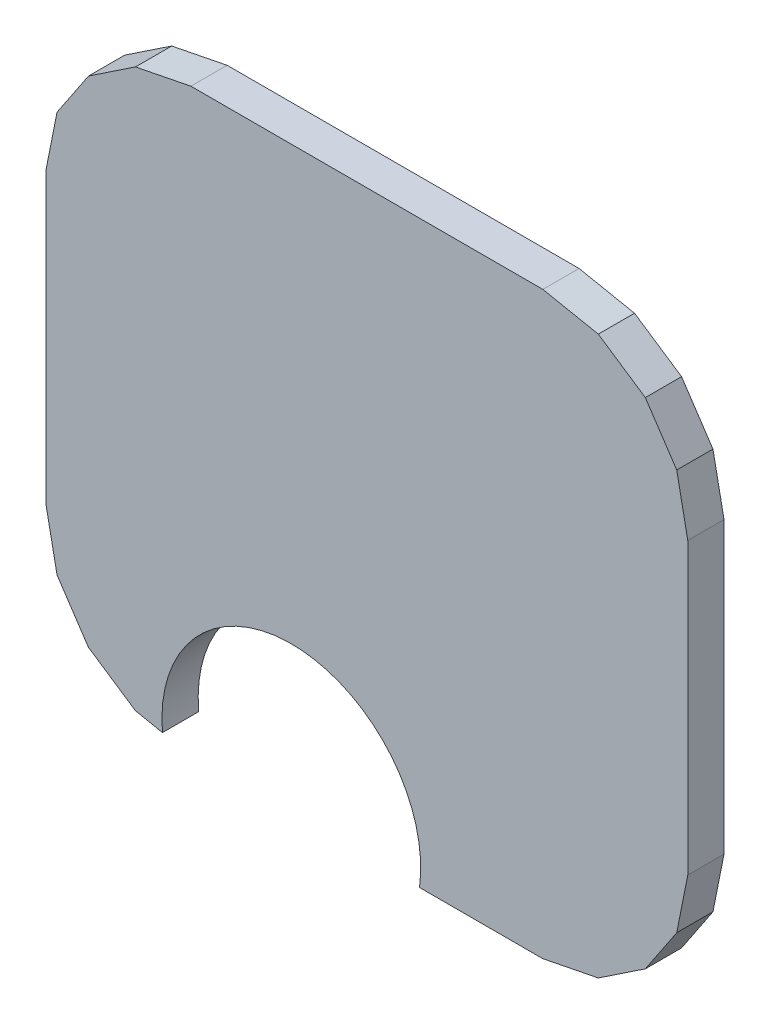
ISO-10303-21;
HEADER;
FILE_DESCRIPTION(('STEP AP214'),'2;1');
FILE_NAME('part.step','',(''),(''),'','','');
FILE_SCHEMA(('AUTOMOTIVE_DESIGN { 1 0 10303 214 1 1 1 1 }'));
ENDSEC;
DATA;
#1=APPLICATION_CONTEXT('core data for automotive mechanical design processes');
#2=APPLICATION_PROTOCOL_DEFINITION('international standard','automotive_design',2000,#1);
#3=PRODUCT_CONTEXT('',#1,'mechanical');
#4=PRODUCT('Part','Part','',(#3));
#5=PRODUCT_RELATED_PRODUCT_CATEGORY('part','',(#4));
#6=PRODUCT_DEFINITION_FORMATION('','',#4);
#7=PRODUCT_DEFINITION_CONTEXT('part definition',#1,'design');
#8=PRODUCT_DEFINITION('design','',#6,#7);
#9=PRODUCT_DEFINITION_SHAPE('','',#8);
#10=(LENGTH_UNIT() NAMED_UNIT(*) SI_UNIT(.MILLI.,.METRE.));
#11=(NAMED_UNIT(*) PLANE_ANGLE_UNIT() SI_UNIT($,.RADIAN.));
#12=(NAMED_UNIT(*) SI_UNIT($,.STERADIAN.) SOLID_ANGLE_UNIT());
#13=UNCERTAINTY_MEASURE_WITH_UNIT(LENGTH_MEASURE(1.E-05),#10,'distance_accuracy_value','');
#14=(GEOMETRIC_REPRESENTATION_CONTEXT(3) GLOBAL_UNCERTAINTY_ASSIGNED_CONTEXT((#13)) GLOBAL_UNIT_ASSIGNED_CONTEXT((#10,
#11,#12)) REPRESENTATION_CONTEXT('',''));
#15=CARTESIAN_POINT('',(0.,0.,0.));
#16=DIRECTION('',(0.,0.,1.));
#17=DIRECTION('',(1.,0.,0.));
#18=AXIS2_PLACEMENT_3D('',#15,#16,#17);
#19=CARTESIAN_POINT('',(153.083,-117.347,1.6));
#20=DIRECTION('',(1.,0.,0.));
#21=DIRECTION('',(0.,1.,0.));
#22=AXIS2_PLACEMENT_3D('',#19,#20,#21);
#23=PLANE('',#22);
#24=DIRECTION('',(0.,0.,1.));
#25=VECTOR('',#24,1.);
#26=CARTESIAN_POINT('',(153.083,-117.347,1.6));
#27=LINE('',#26,#25);
#28=CARTESIAN_POINT('',(153.083,-117.347,1.6));
#29=VERTEX_POINT('',#28);
#30=CARTESIAN_POINT('',(153.083,-117.347,1.635));
#31=VERTEX_POINT('',#30);
#32=EDGE_CURVE('E40',#29,#31,#27,.T.);
#33=ORIENTED_EDGE('',*,*,#32,.T.);
#34=DIRECTION('',(0.,-1.,0.));
#35=VECTOR('',#34,1.);
#36=CARTESIAN_POINT('',(153.083,-117.347,1.635));
#37=LINE('',#36,#35);
#38=CARTESIAN_POINT('',(153.083,-117.627,1.635));
#39=VERTEX_POINT('',#38);
#40=EDGE_CURVE('E419',#31,#39,#37,.T.);
#41=ORIENTED_EDGE('',*,*,#40,.T.);
#42=DIRECTION('',(0.,0.,1.));
#43=VECTOR('',#42,1.);
#44=CARTESIAN_POINT('',(153.083,-117.627,1.6));
#45=LINE('',#44,#43);
#46=CARTESIAN_POINT('',(153.083,-117.627,1.6));
#47=VERTEX_POINT('',#46);
#48=EDGE_CURVE('E11',#47,#39,#45,.T.);
#49=ORIENTED_EDGE('',*,*,#48,.F.);
#50=DIRECTION('',(0.,-1.,0.));
#51=VECTOR('',#50,1.);
#52=CARTESIAN_POINT('',(153.083,-117.347,1.6));
#53=LINE('',#52,#51);
#54=EDGE_CURVE('E274',#29,#47,#53,.T.);
#55=ORIENTED_EDGE('',*,*,#54,.F.);
#56=EDGE_LOOP('',(#33,#41,#49,#55));
#57=FACE_BOUND('',#56,.T.);
#58=ADVANCED_FACE('F17',(#57),#23,.T.);
#59=CARTESIAN_POINT('',(153.083,-117.627,1.6));
#60=DIRECTION('',(0.980785031686367,-0.195091572396073,0.));
#61=DIRECTION('',(0.,0.,-1.));
#62=AXIS2_PLACEMENT_3D('',#59,#60,#61);
#63=PLANE('',#62);
#64=ORIENTED_EDGE('',*,*,#48,.T.);
#65=DIRECTION('',(-0.195091572396073,-0.980785031686367,0.));
#66=VECTOR('',#65,1.);
#67=CARTESIAN_POINT('',(153.083,-117.627,1.635));
#68=LINE('',#67,#66);
#69=CARTESIAN_POINT('',(153.072343,-117.680576,1.635));
#70=VERTEX_POINT('',#69);
#71=EDGE_CURVE('E416',#39,#70,#68,.T.);
#72=ORIENTED_EDGE('',*,*,#71,.T.);
#73=DIRECTION('',(0.,0.,1.));
#74=VECTOR('',#73,1.);
#75=CARTESIAN_POINT('',(153.072343,-117.680576,1.6));
#76=LINE('',#75,#74);
#77=CARTESIAN_POINT('',(153.072343,-117.680576,1.6));
#78=VERTEX_POINT('',#77);
#79=EDGE_CURVE('E27',#78,#70,#76,.T.);
#80=ORIENTED_EDGE('',*,*,#79,.F.);
#81=DIRECTION('',(-0.195091572396073,-0.980785031686367,0.));
#82=VECTOR('',#81,1.);
#83=CARTESIAN_POINT('',(153.083,-117.627,1.6));
#84=LINE('',#83,#82);
#85=EDGE_CURVE('E261',#47,#78,#84,.T.);
#86=ORIENTED_EDGE('',*,*,#85,.F.);
#87=EDGE_LOOP('',(#64,#72,#80,#86));
#88=FACE_BOUND('',#87,.T.);
#89=ADVANCED_FACE('F19',(#88),#63,.T.);
#90=CARTESIAN_POINT('',(153.072343,-117.680576,1.6));
#91=DIRECTION('',(0.831469659284406,-0.555570162706272,0.));
#92=DIRECTION('',(0.,0.,-1.));
#93=AXIS2_PLACEMENT_3D('',#90,#91,#92);
#94=PLANE('',#93);
#95=ORIENTED_EDGE('',*,*,#79,.T.);
#96=DIRECTION('',(-0.555570162706272,-0.831469659284406,0.));
#97=VECTOR('',#96,1.);
#98=CARTESIAN_POINT('',(153.072343,-117.680576,1.635));
#99=LINE('',#98,#97);
#100=CARTESIAN_POINT('',(153.041995,-117.725995,1.635));
#101=VERTEX_POINT('',#100);
#102=EDGE_CURVE('E254',#70,#101,#99,.T.);
#103=ORIENTED_EDGE('',*,*,#102,.T.);
#104=DIRECTION('',(0.,0.,1.));
#105=VECTOR('',#104,1.);
#106=CARTESIAN_POINT('',(153.041995,-117.725995,1.6));
#107=LINE('',#106,#105);
#108=CARTESIAN_POINT('',(153.041995,-117.725995,1.6));
#109=VERTEX_POINT('',#108);
#110=EDGE_CURVE('E21',#109,#101,#107,.T.);
#111=ORIENTED_EDGE('',*,*,#110,.F.);
#112=DIRECTION('',(-0.555570162706272,-0.831469659284406,0.));
#113=VECTOR('',#112,1.);
#114=CARTESIAN_POINT('',(153.072343,-117.680576,1.6));
#115=LINE('',#114,#113);
#116=EDGE_CURVE('E257',#78,#109,#115,.T.);
#117=ORIENTED_EDGE('',*,*,#116,.F.);
#118=EDGE_LOOP('',(#95,#103,#111,#117));
#119=FACE_BOUND('',#118,.T.);
#120=ADVANCED_FACE('F458',(#119),#94,.T.);
#121=CARTESIAN_POINT('',(153.041995,-117.725995,1.6));
#122=DIRECTION('',(0.555570162706963,-0.831469659283945,0.));
#123=DIRECTION('',(0.,0.,-1.));
#124=AXIS2_PLACEMENT_3D('',#121,#122,#123);
#125=PLANE('',#124);
#126=ORIENTED_EDGE('',*,*,#110,.T.);
#127=DIRECTION('',(-0.831469659283945,-0.555570162706963,0.));
#128=VECTOR('',#127,1.);
#129=CARTESIAN_POINT('',(153.041995,-117.725995,1.635));
#130=LINE('',#129,#128);
#131=CARTESIAN_POINT('',(152.996576,-117.756343,1.635));
#132=VERTEX_POINT('',#131);
#133=EDGE_CURVE('E251',#101,#132,#130,.T.);
#134=ORIENTED_EDGE('',*,*,#133,.T.);
#135=DIRECTION('',(0.,0.,1.));
#136=VECTOR('',#135,1.);
#137=CARTESIAN_POINT('',(152.996576,-117.756343,1.6));
#138=LINE('',#137,#136);
#139=CARTESIAN_POINT('',(152.996576,-117.756343,1.6));
#140=VERTEX_POINT('',#139);
#141=EDGE_CURVE('E423',#140,#132,#138,.T.);
#142=ORIENTED_EDGE('',*,*,#141,.F.);
#143=DIRECTION('',(-0.831469659283945,-0.555570162706963,0.));
#144=VECTOR('',#143,1.);
#145=CARTESIAN_POINT('',(153.041995,-117.725995,1.6));
#146=LINE('',#145,#144);
#147=EDGE_CURVE('E260',#109,#140,#146,.T.);
#148=ORIENTED_EDGE('',*,*,#147,.F.);
#149=EDGE_LOOP('',(#126,#134,#142,#148));
#150=FACE_BOUND('',#149,.T.);
#151=ADVANCED_FACE('F452',(#150),#125,.T.);
#152=CARTESIAN_POINT('',(152.996576,-117.756343,1.6));
#153=DIRECTION('',(0.195091572396073,-0.980785031686367,0.));
#154=DIRECTION('',(0.,0.,-1.));
#155=AXIS2_PLACEMENT_3D('',#152,#153,#154);
#156=PLANE('',#155);
#157=ORIENTED_EDGE('',*,*,#141,.T.);
#158=DIRECTION('',(-0.980785031686367,-0.195091572396073,0.));
#159=VECTOR('',#158,1.);
#160=CARTESIAN_POINT('',(152.996576,-117.756343,1.635));
#161=LINE('',#160,#159);
#162=CARTESIAN_POINT('',(152.943,-117.767,1.635));
#163=VERTEX_POINT('',#162);
#164=EDGE_CURVE('E255',#132,#163,#161,.T.);
#165=ORIENTED_EDGE('',*,*,#164,.T.);
#166=DIRECTION('',(0.,0.,1.));
#167=VECTOR('',#166,1.);
#168=CARTESIAN_POINT('',(152.943,-117.767,1.6));
#169=LINE('',#168,#167);
#170=CARTESIAN_POINT('',(152.943,-117.767,1.6));
#171=VERTEX_POINT('',#170);
#172=EDGE_CURVE('E420',#171,#163,#169,.T.);
#173=ORIENTED_EDGE('',*,*,#172,.F.);
#174=DIRECTION('',(-0.980785031686367,-0.195091572396073,0.));
#175=VECTOR('',#174,1.);
#176=CARTESIAN_POINT('',(152.996576,-117.756343,1.6));
#177=LINE('',#176,#175);
#178=EDGE_CURVE('E316',#140,#171,#177,.T.);
#179=ORIENTED_EDGE('',*,*,#178,.F.);
#180=EDGE_LOOP('',(#157,#165,#173,#179));
#181=FACE_BOUND('',#180,.T.);
#182=ADVANCED_FACE('F464',(#181),#156,.T.);
#183=CARTESIAN_POINT('',(152.943,-117.767,1.6));
#184=DIRECTION('',(0.,-1.,0.));
#185=DIRECTION('',(0.,0.,-1.));
#186=AXIS2_PLACEMENT_3D('',#183,#184,#185);
#187=PLANE('',#186);
#188=DIRECTION('',(-1.,0.,0.));
#189=VECTOR('',#188,1.);
#190=CARTESIAN_POINT('',(152.943,-117.767,1.6));
#191=LINE('',#190,#189);
#192=CARTESIAN_POINT('',(152.82383860467,-117.767,1.6));
#193=VERTEX_POINT('',#192);
#194=EDGE_CURVE('E320',#171,#193,#191,.T.);
#195=ORIENTED_EDGE('',*,*,#194,.F.);
#196=ORIENTED_EDGE('',*,*,#172,.T.);
#197=DIRECTION('',(-1.,0.,0.));
#198=VECTOR('',#197,1.);
#199=CARTESIAN_POINT('',(152.943,-117.767,1.635));
#200=LINE('',#199,#198);
#201=CARTESIAN_POINT('',(152.82383860467,-117.767,1.635));
#202=VERTEX_POINT('',#201);
#203=EDGE_CURVE('E406',#163,#202,#200,.T.);
#204=ORIENTED_EDGE('',*,*,#203,.T.);
#205=DIRECTION('',(0.,0.,-1.));
#206=VECTOR('',#205,1.);
#207=CARTESIAN_POINT('',(152.82383860464,-117.767,-0.045));
#208=LINE('',#207,#206);
#209=EDGE_CURVE('E424',#202,#193,#208,.T.);
#210=ORIENTED_EDGE('',*,*,#209,.T.);
#211=EDGE_LOOP('',(#195,#196,#204,#210));
#212=FACE_BOUND('',#211,.T.);
#213=ADVANCED_FACE('F467',(#212),#187,.T.);
#214=CARTESIAN_POINT('',(152.7,-117.75,-0.045));
#215=DIRECTION('',(0.,0.,-1.));
#216=DIRECTION('',(0.,-1.,0.));
#217=AXIS2_PLACEMENT_3D('',#214,#215,#216);
#218=CYLINDRICAL_SURFACE('',#217,0.125);
#219=ORIENTED_EDGE('',*,*,#209,.F.);
#220=CARTESIAN_POINT('',(152.7,-117.75,1.635));
#221=DIRECTION('',(0.,0.,-1.));
#222=DIRECTION('',(0.,-1.,0.));
#223=AXIS2_PLACEMENT_3D('',#220,#221,#222);
#224=CIRCLE('',#223,0.125);
#225=CARTESIAN_POINT('',(152.57553350527,-117.7615365381,1.635));
#226=VERTEX_POINT('',#225);
#227=EDGE_CURVE('E369',#226,#202,#224,.T.);
#228=ORIENTED_EDGE('',*,*,#227,.F.);
#229=DIRECTION('',(0.,0.,-1.));
#230=VECTOR('',#229,1.);
#231=CARTESIAN_POINT('',(152.57553350536,-117.7615365381,-0.045));
#232=LINE('',#231,#230);
#233=CARTESIAN_POINT('',(152.57553350527,-117.7615365381,1.6));
#234=VERTEX_POINT('',#233);
#235=EDGE_CURVE('E360',#226,#234,#232,.T.);
#236=ORIENTED_EDGE('',*,*,#235,.T.);
#237=CARTESIAN_POINT('',(152.7,-117.75,1.6));
#238=DIRECTION('',(0.,0.,-1.));
#239=DIRECTION('',(0.,-1.,0.));
#240=AXIS2_PLACEMENT_3D('',#237,#238,#239);
#241=CIRCLE('',#240,0.125);
#242=EDGE_CURVE('E324',#234,#193,#241,.T.);
#243=ORIENTED_EDGE('',*,*,#242,.T.);
#244=EDGE_LOOP('',(#219,#228,#236,#243));
#245=FACE_BOUND('',#244,.T.);
#246=ADVANCED_FACE('F515',(#245),#218,.F.);
#247=CARTESIAN_POINT('',(152.603,-117.767,1.6));
#248=DIRECTION('',(-0.195091572396073,-0.980785031686367,0.));
#249=DIRECTION('',(-0.980785031686367,0.195091572396073,0.));
#250=AXIS2_PLACEMENT_3D('',#247,#248,#249);
#251=PLANE('',#250);
#252=DIRECTION('',(-0.980785031686367,0.195091572396073,0.));
#253=VECTOR('',#252,1.);
#254=CARTESIAN_POINT('',(152.603,-117.767,1.6));
#255=LINE('',#254,#253);
#256=CARTESIAN_POINT('',(152.549424,-117.756343,1.6));
#257=VERTEX_POINT('',#256);
#258=EDGE_CURVE('E328',#234,#257,#255,.T.);
#259=ORIENTED_EDGE('',*,*,#258,.F.);
#260=ORIENTED_EDGE('',*,*,#235,.F.);
#261=DIRECTION('',(-0.980785031686367,0.195091572396073,0.));
#262=VECTOR('',#261,1.);
#263=CARTESIAN_POINT('',(152.603,-117.767,1.635));
#264=LINE('',#263,#262);
#265=CARTESIAN_POINT('',(152.549424,-117.756343,1.635));
#266=VERTEX_POINT('',#265);
#267=EDGE_CURVE('E365',#226,#266,#264,.T.);
#268=ORIENTED_EDGE('',*,*,#267,.T.);
#269=DIRECTION('',(0.,0.,1.));
#270=VECTOR('',#269,1.);
#271=CARTESIAN_POINT('',(152.549424,-117.756343,1.6));
#272=LINE('',#271,#270);
#273=EDGE_CURVE('E311',#257,#266,#272,.T.);
#274=ORIENTED_EDGE('',*,*,#273,.F.);
#275=EDGE_LOOP('',(#259,#260,#268,#274));
#276=FACE_BOUND('',#275,.T.);
#277=ADVANCED_FACE('F512',(#276),#251,.T.);
#278=CARTESIAN_POINT('',(152.549424,-117.756343,1.6));
#279=DIRECTION('',(-0.555570162706963,-0.831469659283945,0.));
#280=DIRECTION('',(-0.831469659283945,0.555570162706963,0.));
#281=AXIS2_PLACEMENT_3D('',#278,#279,#280);
#282=PLANE('',#281);
#283=ORIENTED_EDGE('',*,*,#273,.T.);
#284=DIRECTION('',(-0.831469659283945,0.555570162706963,0.));
#285=VECTOR('',#284,1.);
#286=CARTESIAN_POINT('',(152.549424,-117.756343,1.635));
#287=LINE('',#286,#285);
#288=CARTESIAN_POINT('',(152.504005,-117.725995,1.635));
#289=VERTEX_POINT('',#288);
#290=EDGE_CURVE('E370',#266,#289,#287,.T.);
#291=ORIENTED_EDGE('',*,*,#290,.T.);
#292=DIRECTION('',(0.,0.,1.));
#293=VECTOR('',#292,1.);
#294=CARTESIAN_POINT('',(152.504005,-117.725995,1.6));
#295=LINE('',#294,#293);
#296=CARTESIAN_POINT('',(152.504005,-117.725995,1.6));
#297=VERTEX_POINT('',#296);
#298=EDGE_CURVE('E308',#297,#289,#295,.T.);
#299=ORIENTED_EDGE('',*,*,#298,.F.);
#300=DIRECTION('',(-0.831469659283945,0.555570162706963,0.));
#301=VECTOR('',#300,1.);
#302=CARTESIAN_POINT('',(152.549424,-117.756343,1.6));
#303=LINE('',#302,#301);
#304=EDGE_CURVE('E302',#257,#297,#303,.T.);
#305=ORIENTED_EDGE('',*,*,#304,.F.);
#306=EDGE_LOOP('',(#283,#291,#299,#305));
#307=FACE_BOUND('',#306,.T.);
#308=ADVANCED_FACE('F508',(#307),#282,.T.);
#309=CARTESIAN_POINT('',(152.504005,-117.725995,1.6));
#310=DIRECTION('',(-0.831469659284406,-0.555570162706272,0.));
#311=DIRECTION('',(-0.555570162706272,0.831469659284406,0.));
#312=AXIS2_PLACEMENT_3D('',#309,#310,#311);
#313=PLANE('',#312);
#314=ORIENTED_EDGE('',*,*,#298,.T.);
#315=DIRECTION('',(-0.555570162706272,0.831469659284406,0.));
#316=VECTOR('',#315,1.);
#317=CARTESIAN_POINT('',(152.504005,-117.725995,1.635));
#318=LINE('',#317,#316);
#319=CARTESIAN_POINT('',(152.473657,-117.680576,1.635));
#320=VERTEX_POINT('',#319);
#321=EDGE_CURVE('E289',#289,#320,#318,.T.);
#322=ORIENTED_EDGE('',*,*,#321,.T.);
#323=DIRECTION('',(0.,0.,1.));
#324=VECTOR('',#323,1.);
#325=CARTESIAN_POINT('',(152.473657,-117.680576,1.6));
#326=LINE('',#325,#324);
#327=CARTESIAN_POINT('',(152.473657,-117.680576,1.6));
#328=VERTEX_POINT('',#327);
#329=EDGE_CURVE('E312',#328,#320,#326,.T.);
#330=ORIENTED_EDGE('',*,*,#329,.F.);
#331=DIRECTION('',(-0.555570162706272,0.831469659284406,0.));
#332=VECTOR('',#331,1.);
#333=CARTESIAN_POINT('',(152.504005,-117.725995,1.6));
#334=LINE('',#333,#332);
#335=EDGE_CURVE('E268',#297,#328,#334,.T.);
#336=ORIENTED_EDGE('',*,*,#335,.F.);
#337=EDGE_LOOP('',(#314,#322,#330,#336));
#338=FACE_BOUND('',#337,.T.);
#339=ADVANCED_FACE('F504',(#338),#313,.T.);
#340=CARTESIAN_POINT('',(152.473657,-117.680576,1.6));
#341=DIRECTION('',(-0.980785031686367,-0.195091572396073,0.));
#342=DIRECTION('',(-0.195091572396073,0.980785031686367,0.));
#343=AXIS2_PLACEMENT_3D('',#340,#341,#342);
#344=PLANE('',#343);
#345=ORIENTED_EDGE('',*,*,#329,.T.);
#346=DIRECTION('',(-0.195091572396073,0.980785031686367,0.));
#347=VECTOR('',#346,1.);
#348=CARTESIAN_POINT('',(152.473657,-117.680576,1.635));
#349=LINE('',#348,#347);
#350=CARTESIAN_POINT('',(152.463,-117.627,1.635));
#351=VERTEX_POINT('',#350);
#352=EDGE_CURVE('E285',#320,#351,#349,.T.);
#353=ORIENTED_EDGE('',*,*,#352,.T.);
#354=DIRECTION('',(0.,0.,1.));
#355=VECTOR('',#354,1.);
#356=CARTESIAN_POINT('',(152.463,-117.627,1.6));
#357=LINE('',#356,#355);
#358=CARTESIAN_POINT('',(152.463,-117.627,1.6));
#359=VERTEX_POINT('',#358);
#360=EDGE_CURVE('E332',#359,#351,#357,.T.);
#361=ORIENTED_EDGE('',*,*,#360,.F.);
#362=DIRECTION('',(-0.195091572396073,0.980785031686367,0.));
#363=VECTOR('',#362,1.);
#364=CARTESIAN_POINT('',(152.473657,-117.680576,1.6));
#365=LINE('',#364,#363);
#366=EDGE_CURVE('E263',#328,#359,#365,.T.);
#367=ORIENTED_EDGE('',*,*,#366,.F.);
#368=EDGE_LOOP('',(#345,#353,#361,#367));
#369=FACE_BOUND('',#368,.T.);
#370=ADVANCED_FACE('F501',(#369),#344,.T.);
#371=CARTESIAN_POINT('',(152.463,-117.627,1.6));
#372=DIRECTION('',(-1.,0.,0.));
#373=DIRECTION('',(0.,0.,1.));
#374=AXIS2_PLACEMENT_3D('',#371,#372,#373);
#375=PLANE('',#374);
#376=ORIENTED_EDGE('',*,*,#360,.T.);
#377=DIRECTION('',(0.,1.,0.));
#378=VECTOR('',#377,1.);
#379=CARTESIAN_POINT('',(152.463,-117.627,1.635));
#380=LINE('',#379,#378);
#381=CARTESIAN_POINT('',(152.463,-117.347,1.635));
#382=VERTEX_POINT('',#381);
#383=EDGE_CURVE('E290',#351,#382,#380,.T.);
#384=ORIENTED_EDGE('',*,*,#383,.T.);
#385=DIRECTION('',(0.,0.,1.));
#386=VECTOR('',#385,1.);
#387=CARTESIAN_POINT('',(152.463,-117.347,1.6));
#388=LINE('',#387,#386);
#389=CARTESIAN_POINT('',(152.463,-117.347,1.6));
#390=VERTEX_POINT('',#389);
#391=EDGE_CURVE('E335',#390,#382,#388,.T.);
#392=ORIENTED_EDGE('',*,*,#391,.F.);
#393=DIRECTION('',(0.,1.,0.));
#394=VECTOR('',#393,1.);
#395=CARTESIAN_POINT('',(152.463,-117.627,1.6));
#396=LINE('',#395,#394);
#397=EDGE_CURVE('E267',#359,#390,#396,.T.);
#398=ORIENTED_EDGE('',*,*,#397,.F.);
#399=EDGE_LOOP('',(#376,#384,#392,#398));
#400=FACE_BOUND('',#399,.T.);
#401=ADVANCED_FACE('F497',(#400),#375,.T.);
#402=CARTESIAN_POINT('',(152.463,-117.347,1.6));
#403=DIRECTION('',(-0.980785031686367,0.195091572396073,0.));
#404=DIRECTION('',(0.,0.,1.));
#405=AXIS2_PLACEMENT_3D('',#402,#403,#404);
#406=PLANE('',#405);
#407=ORIENTED_EDGE('',*,*,#391,.T.);
#408=DIRECTION('',(0.195091572396073,0.980785031686367,0.));
#409=VECTOR('',#408,1.);
#410=CARTESIAN_POINT('',(152.463,-117.347,1.635));
#411=LINE('',#410,#409);
#412=CARTESIAN_POINT('',(152.473657,-117.293424,1.635));
#413=VERTEX_POINT('',#412);
#414=EDGE_CURVE('E391',#382,#413,#411,.T.);
#415=ORIENTED_EDGE('',*,*,#414,.T.);
#416=DIRECTION('',(0.,0.,1.));
#417=VECTOR('',#416,1.);
#418=CARTESIAN_POINT('',(152.473657,-117.293424,1.6));
#419=LINE('',#418,#417);
#420=CARTESIAN_POINT('',(152.473657,-117.293424,1.6));
#421=VERTEX_POINT('',#420);
#422=EDGE_CURVE('E434',#421,#413,#419,.T.);
#423=ORIENTED_EDGE('',*,*,#422,.F.);
#424=DIRECTION('',(0.195091572396073,0.980785031686367,0.));
#425=VECTOR('',#424,1.);
#426=CARTESIAN_POINT('',(152.463,-117.347,1.6));
#427=LINE('',#426,#425);
#428=EDGE_CURVE('E345',#390,#421,#427,.T.);
#429=ORIENTED_EDGE('',*,*,#428,.F.);
#430=EDGE_LOOP('',(#407,#415,#423,#429));
#431=FACE_BOUND('',#430,.T.);
#432=ADVANCED_FACE('F492',(#431),#406,.T.);
#433=CARTESIAN_POINT('',(152.473657,-117.293424,1.6));
#434=DIRECTION('',(-0.831469659284406,0.555570162706272,0.));
#435=DIRECTION('',(0.,0.,1.));
#436=AXIS2_PLACEMENT_3D('',#433,#434,#435);
#437=PLANE('',#436);
#438=ORIENTED_EDGE('',*,*,#422,.T.);
#439=DIRECTION('',(0.555570162706272,0.831469659284406,0.));
#440=VECTOR('',#439,1.);
#441=CARTESIAN_POINT('',(152.473657,-117.293424,1.635));
#442=LINE('',#441,#440);
#443=CARTESIAN_POINT('',(152.504005,-117.248005,1.635));
#444=VERTEX_POINT('',#443);
#445=EDGE_CURVE('E384',#413,#444,#442,.T.);
#446=ORIENTED_EDGE('',*,*,#445,.T.);
#447=DIRECTION('',(0.,0.,1.));
#448=VECTOR('',#447,1.);
#449=CARTESIAN_POINT('',(152.504005,-117.248005,1.6));
#450=LINE('',#449,#448);
#451=CARTESIAN_POINT('',(152.504005,-117.248005,1.6));
#452=VERTEX_POINT('',#451);
#453=EDGE_CURVE('E278',#452,#444,#450,.T.);
#454=ORIENTED_EDGE('',*,*,#453,.F.);
#455=DIRECTION('',(0.555570162706272,0.831469659284406,0.));
#456=VECTOR('',#455,1.);
#457=CARTESIAN_POINT('',(152.473657,-117.293424,1.6));
#458=LINE('',#457,#456);
#459=EDGE_CURVE('E349',#421,#452,#458,.T.);
#460=ORIENTED_EDGE('',*,*,#459,.F.);
#461=EDGE_LOOP('',(#438,#446,#454,#460));
#462=FACE_BOUND('',#461,.T.);
#463=ADVANCED_FACE('F489',(#462),#437,.T.);
#464=CARTESIAN_POINT('',(152.504005,-117.248005,1.6));
#465=DIRECTION('',(-0.555570162706963,0.831469659283945,0.));
#466=DIRECTION('',(0.,0.,1.));
#467=AXIS2_PLACEMENT_3D('',#464,#465,#466);
#468=PLANE('',#467);
#469=ORIENTED_EDGE('',*,*,#453,.T.);
#470=DIRECTION('',(0.831469659283945,0.555570162706963,0.));
#471=VECTOR('',#470,1.);
#472=CARTESIAN_POINT('',(152.504005,-117.248005,1.635));
#473=LINE('',#472,#471);
#474=CARTESIAN_POINT('',(152.549424,-117.217657,1.635));
#475=VERTEX_POINT('',#474);
#476=EDGE_CURVE('E380',#444,#475,#473,.T.);
#477=ORIENTED_EDGE('',*,*,#476,.T.);
#478=DIRECTION('',(0.,0.,1.));
#479=VECTOR('',#478,1.);
#480=CARTESIAN_POINT('',(152.549424,-117.217657,1.6));
#481=LINE('',#480,#479);
#482=CARTESIAN_POINT('',(152.549424,-117.217657,1.6));
#483=VERTEX_POINT('',#482);
#484=EDGE_CURVE('E275',#483,#475,#481,.T.);
#485=ORIENTED_EDGE('',*,*,#484,.F.);
#486=DIRECTION('',(0.831469659283945,0.555570162706963,0.));
#487=VECTOR('',#486,1.);
#488=CARTESIAN_POINT('',(152.504005,-117.248005,1.6));
#489=LINE('',#488,#487);
#490=EDGE_CURVE('E353',#452,#483,#489,.T.);
#491=ORIENTED_EDGE('',*,*,#490,.F.);
#492=EDGE_LOOP('',(#469,#477,#485,#491));
#493=FACE_BOUND('',#492,.T.);
#494=ADVANCED_FACE('F485',(#493),#468,.T.);
#495=CARTESIAN_POINT('',(152.549424,-117.217657,1.6));
#496=DIRECTION('',(-0.195091572396073,0.980785031686367,0.));
#497=DIRECTION('',(0.,0.,1.));
#498=AXIS2_PLACEMENT_3D('',#495,#496,#497);
#499=PLANE('',#498);
#500=ORIENTED_EDGE('',*,*,#484,.T.);
#501=DIRECTION('',(0.980785031686367,0.195091572396073,0.));
#502=VECTOR('',#501,1.);
#503=CARTESIAN_POINT('',(152.549424,-117.217657,1.635));
#504=LINE('',#503,#502);
#505=CARTESIAN_POINT('',(152.603,-117.207,1.635));
#506=VERTEX_POINT('',#505);
#507=EDGE_CURVE('E376',#475,#506,#504,.T.);
#508=ORIENTED_EDGE('',*,*,#507,.T.);
#509=DIRECTION('',(0.,0.,1.));
#510=VECTOR('',#509,1.);
#511=CARTESIAN_POINT('',(152.603,-117.207,1.6));
#512=LINE('',#511,#510);
#513=CARTESIAN_POINT('',(152.603,-117.207,1.6));
#514=VERTEX_POINT('',#513);
#515=EDGE_CURVE('E341',#514,#506,#512,.T.);
#516=ORIENTED_EDGE('',*,*,#515,.F.);
#517=DIRECTION('',(0.980785031686367,0.195091572396073,0.));
#518=VECTOR('',#517,1.);
#519=CARTESIAN_POINT('',(152.549424,-117.217657,1.6));
#520=LINE('',#519,#518);
#521=EDGE_CURVE('E357',#483,#514,#520,.T.);
#522=ORIENTED_EDGE('',*,*,#521,.F.);
#523=EDGE_LOOP('',(#500,#508,#516,#522));
#524=FACE_BOUND('',#523,.T.);
#525=ADVANCED_FACE('F480',(#524),#499,.T.);
#526=CARTESIAN_POINT('',(153.072343,-117.293424,1.6));
#527=DIRECTION('',(0.980785031686367,0.195091572396073,0.));
#528=DIRECTION('',(0.,0.,-1.));
#529=AXIS2_PLACEMENT_3D('',#526,#527,#528);
#530=PLANE('',#529);
#531=DIRECTION('',(0.,0.,1.));
#532=VECTOR('',#531,1.);
#533=CARTESIAN_POINT('',(153.072343,-117.293424,1.6));
#534=LINE('',#533,#532);
#535=CARTESIAN_POINT('',(153.072343,-117.293424,1.6));
#536=VERTEX_POINT('',#535);
#537=CARTESIAN_POINT('',(153.072343,-117.293424,1.635));
#538=VERTEX_POINT('',#537);
#539=EDGE_CURVE('E282',#536,#538,#534,.T.);
#540=ORIENTED_EDGE('',*,*,#539,.T.);
#541=DIRECTION('',(0.195091572396073,-0.980785031686367,0.));
#542=VECTOR('',#541,1.);
#543=CARTESIAN_POINT('',(153.072343,-117.293424,1.635));
#544=LINE('',#543,#542);
#545=EDGE_CURVE('E427',#538,#31,#544,.T.);
#546=ORIENTED_EDGE('',*,*,#545,.T.);
#547=ORIENTED_EDGE('',*,*,#32,.F.);
#548=DIRECTION('',(0.195091572396073,-0.980785031686367,0.));
#549=VECTOR('',#548,1.);
#550=CARTESIAN_POINT('',(153.072343,-117.293424,1.6));
#551=LINE('',#550,#549);
#552=EDGE_CURVE('E295',#536,#29,#551,.T.);
#553=ORIENTED_EDGE('',*,*,#552,.F.);
#554=EDGE_LOOP('',(#540,#546,#547,#553));
#555=FACE_BOUND('',#554,.T.);
#556=ADVANCED_FACE('F472',(#555),#530,.T.);
#557=CARTESIAN_POINT('',(152.603,-117.207,1.6));
#558=DIRECTION('',(0.,1.,0.));
#559=DIRECTION('',(1.,0.,0.));
#560=AXIS2_PLACEMENT_3D('',#557,#558,#559);
#561=PLANE('',#560);
#562=ORIENTED_EDGE('',*,*,#515,.T.);
#563=DIRECTION('',(1.,0.,0.));
#564=VECTOR('',#563,1.);
#565=CARTESIAN_POINT('',(152.603,-117.207,1.635));
#566=LINE('',#565,#564);
#567=CARTESIAN_POINT('',(152.943,-117.207,1.635));
#568=VERTEX_POINT('',#567);
#569=EDGE_CURVE('E373',#506,#568,#566,.T.);
#570=ORIENTED_EDGE('',*,*,#569,.T.);
#571=DIRECTION('',(0.,0.,1.));
#572=VECTOR('',#571,1.);
#573=CARTESIAN_POINT('',(152.943,-117.207,1.6));
#574=LINE('',#573,#572);
#575=CARTESIAN_POINT('',(152.943,-117.207,1.6));
#576=VERTEX_POINT('',#575);
#577=EDGE_CURVE('E235',#576,#568,#574,.T.);
#578=ORIENTED_EDGE('',*,*,#577,.F.);
#579=DIRECTION('',(1.,0.,0.));
#580=VECTOR('',#579,1.);
#581=CARTESIAN_POINT('',(152.603,-117.207,1.6));
#582=LINE('',#581,#580);
#583=EDGE_CURVE('E218',#514,#576,#582,.T.);
#584=ORIENTED_EDGE('',*,*,#583,.F.);
#585=EDGE_LOOP('',(#562,#570,#578,#584));
#586=FACE_BOUND('',#585,.T.);
#587=ADVANCED_FACE('F477',(#586),#561,.T.);
#588=CARTESIAN_POINT('',(152.773,-117.487,1.635));
#589=DIRECTION('',(0.,0.,-1.));
#590=DIRECTION('',(0.,-1.,0.));
#591=AXIS2_PLACEMENT_3D('',#588,#589,#590);
#592=PLANE('',#591);
#593=ORIENTED_EDGE('',*,*,#569,.F.);
#594=ORIENTED_EDGE('',*,*,#507,.F.);
#595=ORIENTED_EDGE('',*,*,#476,.F.);
#596=ORIENTED_EDGE('',*,*,#445,.F.);
#597=ORIENTED_EDGE('',*,*,#414,.F.);
#598=ORIENTED_EDGE('',*,*,#383,.F.);
#599=ORIENTED_EDGE('',*,*,#352,.F.);
#600=ORIENTED_EDGE('',*,*,#321,.F.);
#601=ORIENTED_EDGE('',*,*,#290,.F.);
#602=ORIENTED_EDGE('',*,*,#267,.F.);
#603=ORIENTED_EDGE('',*,*,#227,.T.);
#604=ORIENTED_EDGE('',*,*,#203,.F.);
#605=ORIENTED_EDGE('',*,*,#164,.F.);
#606=ORIENTED_EDGE('',*,*,#133,.F.);
#607=ORIENTED_EDGE('',*,*,#102,.F.);
#608=ORIENTED_EDGE('',*,*,#71,.F.);
#609=ORIENTED_EDGE('',*,*,#40,.F.);
#610=ORIENTED_EDGE('',*,*,#545,.F.);
#611=DIRECTION('',(0.555570162706272,-0.831469659284406,0.));
#612=VECTOR('',#611,1.);
#613=CARTESIAN_POINT('',(153.041995,-117.248005,1.635));
#614=LINE('',#613,#612);
#615=CARTESIAN_POINT('',(153.041995,-117.248005,1.635));
#616=VERTEX_POINT('',#615);
#617=EDGE_CURVE('E224',#616,#538,#614,.T.);
#618=ORIENTED_EDGE('',*,*,#617,.F.);
#619=DIRECTION('',(0.831469659283945,-0.555570162706963,0.));
#620=VECTOR('',#619,1.);
#621=CARTESIAN_POINT('',(152.996576,-117.217657,1.635));
#622=LINE('',#621,#620);
#623=CARTESIAN_POINT('',(152.996576,-117.217657,1.635));
#624=VERTEX_POINT('',#623);
#625=EDGE_CURVE('E241',#624,#616,#622,.T.);
#626=ORIENTED_EDGE('',*,*,#625,.F.);
#627=DIRECTION('',(0.980785031686367,-0.195091572396073,0.));
#628=VECTOR('',#627,1.);
#629=CARTESIAN_POINT('',(152.943,-117.207,1.635));
#630=LINE('',#629,#628);
#631=EDGE_CURVE('E225',#568,#624,#630,.T.);
#632=ORIENTED_EDGE('',*,*,#631,.F.);
#633=EDGE_LOOP('',(#593,#594,#595,#596,#597,#598,#599,#600,#601,#602,#603,#604,#605,#606,#607,
#608,#609,#610,#618,#626,#632));
#634=FACE_BOUND('',#633,.T.);
#635=ADVANCED_FACE('F462',(#634),#592,.F.);
#636=CARTESIAN_POINT('',(152.773,-117.487,1.6));
#637=DIRECTION('',(0.,0.,-1.));
#638=DIRECTION('',(0.,-1.,0.));
#639=AXIS2_PLACEMENT_3D('',#636,#637,#638);
#640=PLANE('',#639);
#641=DIRECTION('',(0.980785031686367,-0.195091572396073,0.));
#642=VECTOR('',#641,1.);
#643=CARTESIAN_POINT('',(152.943,-117.207,1.6));
#644=LINE('',#643,#642);
#645=CARTESIAN_POINT('',(152.996576,-117.217657,1.6));
#646=VERTEX_POINT('',#645);
#647=EDGE_CURVE('E210',#576,#646,#644,.T.);
#648=ORIENTED_EDGE('',*,*,#647,.T.);
#649=DIRECTION('',(0.831469659283945,-0.555570162706963,0.));
#650=VECTOR('',#649,1.);
#651=CARTESIAN_POINT('',(152.996576,-117.217657,1.6));
#652=LINE('',#651,#650);
#653=CARTESIAN_POINT('',(153.041995,-117.248005,1.6));
#654=VERTEX_POINT('',#653);
#655=EDGE_CURVE('E214',#646,#654,#652,.T.);
#656=ORIENTED_EDGE('',*,*,#655,.T.);
#657=DIRECTION('',(0.555570162706272,-0.831469659284406,0.));
#658=VECTOR('',#657,1.);
#659=CARTESIAN_POINT('',(153.041995,-117.248005,1.6));
#660=LINE('',#659,#658);
#661=EDGE_CURVE('E294',#654,#536,#660,.T.);
#662=ORIENTED_EDGE('',*,*,#661,.T.);
#663=ORIENTED_EDGE('',*,*,#552,.T.);
#664=ORIENTED_EDGE('',*,*,#54,.T.);
#665=ORIENTED_EDGE('',*,*,#85,.T.);
#666=ORIENTED_EDGE('',*,*,#116,.T.);
#667=ORIENTED_EDGE('',*,*,#147,.T.);
#668=ORIENTED_EDGE('',*,*,#178,.T.);
#669=ORIENTED_EDGE('',*,*,#194,.T.);
#670=ORIENTED_EDGE('',*,*,#242,.F.);
#671=ORIENTED_EDGE('',*,*,#258,.T.);
#672=ORIENTED_EDGE('',*,*,#304,.T.);
#673=ORIENTED_EDGE('',*,*,#335,.T.);
#674=ORIENTED_EDGE('',*,*,#366,.T.);
#675=ORIENTED_EDGE('',*,*,#397,.T.);
#676=ORIENTED_EDGE('',*,*,#428,.T.);
#677=ORIENTED_EDGE('',*,*,#459,.T.);
#678=ORIENTED_EDGE('',*,*,#490,.T.);
#679=ORIENTED_EDGE('',*,*,#521,.T.);
#680=ORIENTED_EDGE('',*,*,#583,.T.);
#681=EDGE_LOOP('',(#648,#656,#662,#663,#664,#665,#666,#667,#668,#669,#670,#671,#672,#673,#674,
#675,#676,#677,#678,#679,#680));
#682=FACE_BOUND('',#681,.T.);
#683=ADVANCED_FACE('F212',(#682),#640,.T.);
#684=CARTESIAN_POINT('',(153.041995,-117.248005,1.6));
#685=DIRECTION('',(0.831469659284406,0.555570162706272,0.));
#686=DIRECTION('',(0.,0.,-1.));
#687=AXIS2_PLACEMENT_3D('',#684,#685,#686);
#688=PLANE('',#687);
#689=DIRECTION('',(0.,0.,1.));
#690=VECTOR('',#689,1.);
#691=CARTESIAN_POINT('',(153.041995,-117.248005,1.6));
#692=LINE('',#691,#690);
#693=EDGE_CURVE('E233',#654,#616,#692,.T.);
#694=ORIENTED_EDGE('',*,*,#693,.T.);
#695=ORIENTED_EDGE('',*,*,#617,.T.);
#696=ORIENTED_EDGE('',*,*,#539,.F.);
#697=ORIENTED_EDGE('',*,*,#661,.F.);
#698=EDGE_LOOP('',(#694,#695,#696,#697));
#699=FACE_BOUND('',#698,.T.);
#700=ADVANCED_FACE('F474',(#699),#688,.T.);
#701=CARTESIAN_POINT('',(152.943,-117.207,1.6));
#702=DIRECTION('',(0.195091572396073,0.980785031686367,0.));
#703=DIRECTION('',(0.,0.,-1.));
#704=AXIS2_PLACEMENT_3D('',#701,#702,#703);
#705=PLANE('',#704);
#706=ORIENTED_EDGE('',*,*,#577,.T.);
#707=ORIENTED_EDGE('',*,*,#631,.T.);
#708=DIRECTION('',(0.,0.,1.));
#709=VECTOR('',#708,1.);
#710=CARTESIAN_POINT('',(152.996576,-117.217657,1.6));
#711=LINE('',#710,#709);
#712=EDGE_CURVE('E231',#646,#624,#711,.T.);
#713=ORIENTED_EDGE('',*,*,#712,.F.);
#714=ORIENTED_EDGE('',*,*,#647,.F.);
#715=EDGE_LOOP('',(#706,#707,#713,#714));
#716=FACE_BOUND('',#715,.T.);
#717=ADVANCED_FACE('F237',(#716),#705,.T.);
#718=CARTESIAN_POINT('',(152.996576,-117.217657,1.6));
#719=DIRECTION('',(0.555570162706963,0.831469659283945,0.));
#720=DIRECTION('',(0.,0.,-1.));
#721=AXIS2_PLACEMENT_3D('',#718,#719,#720);
#722=PLANE('',#721);
#723=ORIENTED_EDGE('',*,*,#712,.T.);
#724=ORIENTED_EDGE('',*,*,#625,.T.);
#725=ORIENTED_EDGE('',*,*,#693,.F.);
#726=ORIENTED_EDGE('',*,*,#655,.F.);
#727=EDGE_LOOP('',(#723,#724,#725,#726));
#728=FACE_BOUND('',#727,.T.);
#729=ADVANCED_FACE('F229',(#728),#722,.T.);
#730=CLOSED_SHELL('',(#58,#89,#120,#151,#182,#213,#246,#277,#308,#339,#370,#401,#432,#463,#494,
#525,#556,#587,#635,#683,#700,#717,#729));
#731=MANIFOLD_SOLID_BREP('B1',#730);
#732=ADVANCED_BREP_SHAPE_REPRESENTATION('',(#18,#731),#14);
#733=SHAPE_DEFINITION_REPRESENTATION(#9,#732);
ENDSEC;
END-ISO-10303-21;
